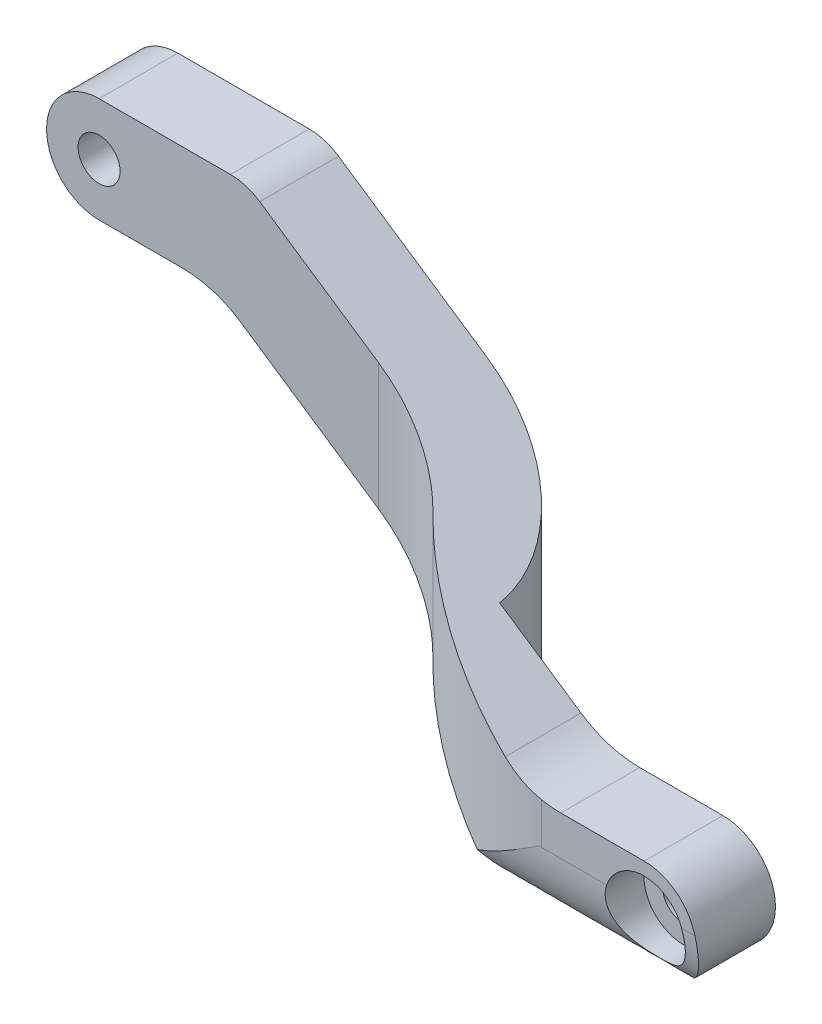
ISO-10303-21;
HEADER;
FILE_DESCRIPTION(('STEP AP214'),'2;1');
FILE_NAME('part.step','',(''),(''),'','','');
FILE_SCHEMA(('AUTOMOTIVE_DESIGN { 1 0 10303 214 1 1 1 1 }'));
ENDSEC;
DATA;
#1=APPLICATION_CONTEXT('core data for automotive mechanical design processes');
#2=APPLICATION_PROTOCOL_DEFINITION('international standard','automotive_design',2000,#1);
#3=PRODUCT_CONTEXT('',#1,'mechanical');
#4=PRODUCT('Part','Part','',(#3));
#5=PRODUCT_RELATED_PRODUCT_CATEGORY('part','',(#4));
#6=PRODUCT_DEFINITION_FORMATION('','',#4);
#7=PRODUCT_DEFINITION_CONTEXT('part definition',#1,'design');
#8=PRODUCT_DEFINITION('design','',#6,#7);
#9=PRODUCT_DEFINITION_SHAPE('','',#8);
#10=(LENGTH_UNIT() NAMED_UNIT(*) SI_UNIT(.MILLI.,.METRE.));
#11=(NAMED_UNIT(*) PLANE_ANGLE_UNIT() SI_UNIT($,.RADIAN.));
#12=(NAMED_UNIT(*) SI_UNIT($,.STERADIAN.) SOLID_ANGLE_UNIT());
#13=UNCERTAINTY_MEASURE_WITH_UNIT(LENGTH_MEASURE(1.E-05),#10,'distance_accuracy_value','');
#14=(GEOMETRIC_REPRESENTATION_CONTEXT(3) GLOBAL_UNCERTAINTY_ASSIGNED_CONTEXT((#13)) GLOBAL_UNIT_ASSIGNED_CONTEXT((#10,
#11,#12)) REPRESENTATION_CONTEXT('',''));
#15=CARTESIAN_POINT('',(0.,0.,0.));
#16=DIRECTION('',(0.,0.,1.));
#17=DIRECTION('',(1.,0.,0.));
#18=AXIS2_PLACEMENT_3D('',#15,#16,#17);
#19=CARTESIAN_POINT('',(0.,-5.5,-4.5));
#20=DIRECTION('',(0.,0.,1.));
#21=DIRECTION('',(1.,0.,0.));
#22=AXIS2_PLACEMENT_3D('',#19,#20,#21);
#23=CYLINDRICAL_SURFACE('',#22,0.799999999999998);
#24=CARTESIAN_POINT('',(0.,-5.5,0.));
#25=DIRECTION('',(0.,0.,1.));
#26=DIRECTION('',(1.,0.,0.));
#27=AXIS2_PLACEMENT_3D('',#24,#25,#26);
#28=CIRCLE('',#27,0.799999999999998);
#29=CARTESIAN_POINT('',(0.799999999999998,-5.5,0.));
#30=VERTEX_POINT('',#29);
#31=EDGE_CURVE('E339',#30,#30,#28,.F.);
#32=ORIENTED_EDGE('',*,*,#31,.T.);
#33=EDGE_LOOP('',(#32));
#34=FACE_BOUND('',#33,.T.);
#35=CARTESIAN_POINT('',(0.,-5.5,1.5));
#36=DIRECTION('',(0.,0.,1.));
#37=DIRECTION('',(1.,0.,0.));
#38=AXIS2_PLACEMENT_3D('',#35,#36,#37);
#39=CIRCLE('',#38,0.799999999999998);
#40=CARTESIAN_POINT('',(0.799999999999998,-5.5,1.5));
#41=VERTEX_POINT('',#40);
#42=EDGE_CURVE('E39',#41,#41,#39,.F.);
#43=ORIENTED_EDGE('',*,*,#42,.F.);
#44=EDGE_LOOP('',(#43));
#45=FACE_BOUND('',#44,.T.);
#46=ADVANCED_FACE('F35',(#34,#45),#23,.F.);
#47=CARTESIAN_POINT('',(0.,-5.5,-4.5));
#48=DIRECTION('',(0.,0.,1.));
#49=DIRECTION('',(1.,0.,0.));
#50=AXIS2_PLACEMENT_3D('',#47,#48,#49);
#51=CYLINDRICAL_SURFACE('',#50,2.);
#52=DIRECTION('',(0.,0.,1.));
#53=VECTOR('',#52,1.);
#54=CARTESIAN_POINT('',(1.9364916731037,-5.,-4.5));
#55=LINE('',#54,#53);
#56=CARTESIAN_POINT('',(1.9364916731037,-5.,3.));
#57=VERTEX_POINT('',#56);
#58=CARTESIAN_POINT('',(1.9364916731037,-5.,2.99949844879359));
#59=VERTEX_POINT('',#58);
#60=EDGE_CURVE('E192',#57,#59,#55,.F.);
#61=ORIENTED_EDGE('',*,*,#60,.T.);
#62=CARTESIAN_POINT('',(1.9364916731037,-5.,2.99949844879359));
#63=CARTESIAN_POINT('',(1.94951068928083,-5.05039154014287,2.99874192304591));
#64=CARTESIAN_POINT('',(1.96054437039431,-5.10128152286284,2.99709892287551));
#65=CARTESIAN_POINT('',(1.97860634253694,-5.2036705201631,2.99197444255661));
#66=CARTESIAN_POINT('',(1.98563504624341,-5.25516947143619,2.98849315189884));
#67=CARTESIAN_POINT('',(1.99564042689507,-5.35824853738819,2.97963936267847));
#68=CARTESIAN_POINT('',(1.99862886372892,-5.40982797712096,2.97427241035933));
#69=CARTESIAN_POINT('',(2.00062303694968,-5.5128141869781,2.96162666635356));
#70=CARTESIAN_POINT('',(1.99962884769324,-5.56422096030825,2.95434791036316));
#71=CARTESIAN_POINT('',(1.99075294064837,-5.71763991938488,2.92963291122908));
#72=CARTESIAN_POINT('',(1.97698454913218,-5.81892166138555,2.90931196557867));
#73=CARTESIAN_POINT('',(1.93479805650347,-6.01651647074127,2.86136881880131));
#74=CARTESIAN_POINT('',(1.90637570864741,-6.11282808883946,2.83374450227534));
#75=CARTESIAN_POINT('',(1.8355138915785,-6.30077333512743,2.77105908847287));
#76=CARTESIAN_POINT('',(1.79271965389449,-6.39221279331376,2.73581875345518));
#77=CARTESIAN_POINT('',(1.6953017912771,-6.56577250029739,2.65931334566206));
#78=CARTESIAN_POINT('',(1.64067306333566,-6.64788870557421,2.6180456764212));
#79=CARTESIAN_POINT('',(1.51530913887125,-6.80972820646089,2.52586257005735));
#80=CARTESIAN_POINT('',(1.44348295682705,-6.88828600345515,2.47438865721268));
#81=CARTESIAN_POINT('',(1.29038534629013,-7.03163935781744,2.36659003392525));
#82=CARTESIAN_POINT('',(1.20910904750735,-7.09642776980896,2.31026282615526));
#83=CARTESIAN_POINT('',(1.02780440266656,-7.21965649527167,2.18597436494093));
#84=CARTESIAN_POINT('',(0.926731786790055,-7.27601601908801,2.11747567985419));
#85=CARTESIAN_POINT('',(0.718210156132909,-7.3701005494721,1.97717287104123));
#86=CARTESIAN_POINT('',(0.610752507630267,-7.4077996505596,1.9053643025747));
#87=CARTESIAN_POINT('',(0.420477451135562,-7.4570943115328,1.7786943241674));
#88=CARTESIAN_POINT('',(0.33844819723138,-7.47291356483976,1.72423553473926));
#89=CARTESIAN_POINT('',(0.173414611958348,-7.49420081213022,1.61481835940262));
#90=CARTESIAN_POINT('',(0.0904110631343508,-7.49967660856283,1.55986038152196));
#91=CARTESIAN_POINT('',(0.00497181418730571,-7.49999537011195,1.503291791691));
#92=CARTESIAN_POINT('',(0.00248587686778617,-7.50000000504475,1.50164587586829));
#93=CARTESIAN_POINT('',(0.,-7.5,1.5));
#94=B_SPLINE_CURVE_WITH_KNOTS('',3,(#62,#63,#64,#65,#66,#67,#68,#69,#70,#71,#72,#73,#74,#75,#76,
#77,#78,#79,#80,#81,#82,#83,#84,#85,#86,#87,#88,#89,#90,#91,#92,#93),.UNSPECIFIED.,.F.,.F.,(4,2,
2,2,2,2,2,2,2,2,2,2,2,2,2,4),(0.,0.156105486751539,0.312194885310391,0.467828973699098,
0.62346015637291,0.934510835851001,1.24565170909995,1.56511929672409,1.88472491328798,
2.23803389094328,2.59152576671572,2.99337391979603,3.39577838799437,3.69446021963918,
3.99291665450242,4.00186093722053),.UNSPECIFIED.);
#95=CARTESIAN_POINT('',(0.,-7.5,1.5));
#96=VERTEX_POINT('',#95);
#97=EDGE_CURVE('E302',#59,#96,#94,.T.);
#98=ORIENTED_EDGE('',*,*,#97,.T.);
#99=DIRECTION('',(0.,0.,1.));
#100=VECTOR('',#99,1.);
#101=CARTESIAN_POINT('',(0.,-7.5,-4.5));
#102=LINE('',#101,#100);
#103=CARTESIAN_POINT('',(0.,-7.5,0.));
#104=VERTEX_POINT('',#103);
#105=EDGE_CURVE('E382',#104,#96,#102,.T.);
#106=ORIENTED_EDGE('',*,*,#105,.F.);
#107=CARTESIAN_POINT('',(0.,-5.5,0.));
#108=DIRECTION('',(0.,0.,1.));
#109=DIRECTION('',(1.,0.,0.));
#110=AXIS2_PLACEMENT_3D('',#107,#108,#109);
#111=CIRCLE('',#110,2.);
#112=CARTESIAN_POINT('',(0.,-3.5,0.));
#113=VERTEX_POINT('',#112);
#114=EDGE_CURVE('E337',#113,#104,#111,.F.);
#115=ORIENTED_EDGE('',*,*,#114,.F.);
#116=DIRECTION('',(0.,0.,1.));
#117=VECTOR('',#116,1.);
#118=CARTESIAN_POINT('',(0.,-3.5,-4.5));
#119=LINE('',#118,#117);
#120=CARTESIAN_POINT('',(0.,-3.5,3.));
#121=VERTEX_POINT('',#120);
#122=EDGE_CURVE('E379',#113,#121,#119,.T.);
#123=ORIENTED_EDGE('',*,*,#122,.T.);
#124=CARTESIAN_POINT('',(0.,-5.5,3.));
#125=DIRECTION('',(0.,0.,1.));
#126=DIRECTION('',(1.,0.,0.));
#127=AXIS2_PLACEMENT_3D('',#124,#125,#126);
#128=CIRCLE('',#127,2.);
#129=EDGE_CURVE('E346',#57,#121,#128,.T.);
#130=ORIENTED_EDGE('',*,*,#129,.F.);
#131=EDGE_LOOP('',(#61,#98,#106,#115,#123,#130));
#132=FACE_BOUND('',#131,.T.);
#133=ADVANCED_FACE('F265',(#132),#51,.T.);
#134=CARTESIAN_POINT('',(-5.,-5.5,-4.5));
#135=DIRECTION('',(0.,0.,1.));
#136=DIRECTION('',(1.,0.,0.));
#137=AXIS2_PLACEMENT_3D('',#134,#135,#136);
#138=CYLINDRICAL_SURFACE('',#137,1.99999999999982);
#139=DIRECTION('',(0.,0.,1.));
#140=VECTOR('',#139,1.);
#141=CARTESIAN_POINT('',(-4.99999999999998,-7.49999999999982,-4.5));
#142=LINE('',#141,#140);
#143=CARTESIAN_POINT('',(-5.,-7.5,0.));
#144=VERTEX_POINT('',#143);
#145=CARTESIAN_POINT('',(-5.,-7.5,1.5));
#146=VERTEX_POINT('',#145);
#147=EDGE_CURVE('E384',#144,#146,#142,.T.);
#148=ORIENTED_EDGE('',*,*,#147,.T.);
#149=CARTESIAN_POINT('',(-6.11665663799226,-7.15924017334053,2.24688622939302));
#150=CARTESIAN_POINT('',(-6.01098533267029,-7.23032185093742,2.17450878875579));
#151=CARTESIAN_POINT('',(-5.90009045905091,-7.29033595560832,2.09945104947399));
#152=CARTESIAN_POINT('',(-5.6632372431095,-7.39152289630056,1.94033230386574));
#153=CARTESIAN_POINT('',(-5.53676764732191,-7.43109579273655,1.85600814910061));
#154=CARTESIAN_POINT('',(-5.27602322715624,-7.48545682702567,1.68275865143513));
#155=CARTESIAN_POINT('',(-5.14162828978862,-7.49948529927838,1.59377087890907));
#156=CARTESIAN_POINT('',(-5.00497178236216,-7.49999537440278,1.50329177040488));
#157=CARTESIAN_POINT('',(-5.0024858451283,-7.50000000927803,1.50164585462645));
#158=CARTESIAN_POINT('',(-5.,-7.49999999999991,1.5));
#159=B_SPLINE_CURVE_WITH_KNOTS('',3,(#149,#150,#151,#152,#153,#154,#155,#156,#157,#158),
.UNSPECIFIED.,.F.,.F.,(4,2,2,2,4),(0.,0.438505616577245,0.907496862960491,1.39022088766092,
1.39916517037903),.UNSPECIFIED.);
#160=CARTESIAN_POINT('',(-6.11665663799226,-7.15924017334053,2.24688622939302));
#161=VERTEX_POINT('',#160);
#162=EDGE_CURVE('E210',#146,#161,#159,.F.);
#163=ORIENTED_EDGE('',*,*,#162,.T.);
#164=DIRECTION('',(0.,0.,1.));
#165=VECTOR('',#164,1.);
#166=CARTESIAN_POINT('',(-6.11665663799226,-7.15924017334053,-4.5));
#167=LINE('',#166,#165);
#168=CARTESIAN_POINT('',(-6.11665663799226,-7.15924017334053,0.));
#169=VERTEX_POINT('',#168);
#170=EDGE_CURVE('E387',#169,#161,#167,.T.);
#171=ORIENTED_EDGE('',*,*,#170,.F.);
#172=CARTESIAN_POINT('',(-5.,-5.5,0.));
#173=DIRECTION('',(0.,0.,1.));
#174=DIRECTION('',(1.,0.,0.));
#175=AXIS2_PLACEMENT_3D('',#172,#173,#174);
#176=CIRCLE('',#175,1.99999999999982);
#177=EDGE_CURVE('E344',#144,#169,#176,.F.);
#178=ORIENTED_EDGE('',*,*,#177,.F.);
#179=EDGE_LOOP('',(#148,#163,#171,#178));
#180=FACE_BOUND('',#179,.T.);
#181=ADVANCED_FACE('F272',(#180),#138,.T.);
#182=CARTESIAN_POINT('',(-5.22291133313636,-7.76072430045907,-4.5));
#183=DIRECTION('',(-0.558328318996176,-0.829620086670341,0.));
#184=DIRECTION('',(0.829620086670341,-0.558328318996176,0.));
#185=AXIS2_PLACEMENT_3D('',#182,#183,#184);
#186=PLANE('',#185);
#187=ORIENTED_EDGE('',*,*,#170,.T.);
#188=CARTESIAN_POINT('',(-6.11665663799226,-7.15924017334053,2.24688622939302));
#189=CARTESIAN_POINT('',(-6.1578710695168,-7.13150315896346,2.27507982111223));
#190=CARTESIAN_POINT('',(-6.19978812795227,-7.10329328175633,2.30171479782673));
#191=CARTESIAN_POINT('',(-6.28469343313913,-7.04615262535167,2.35227245099428));
#192=CARTESIAN_POINT('',(-6.32768074152116,-7.01722247766993,2.37619740799531));
#193=CARTESIAN_POINT('',(-6.41425214045248,-6.95896055222347,2.42167534398547));
#194=CARTESIAN_POINT('',(-6.45783230689211,-6.92963141535618,2.44323930340539));
#195=CARTESIAN_POINT('',(-6.54563078444566,-6.87054367487048,2.48442424275833));
#196=CARTESIAN_POINT('',(-6.5898492584233,-6.84078496164597,2.50404471640147));
#197=CARTESIAN_POINT('',(-6.680901805764,-6.77950725572508,2.54246543332115));
#198=CARTESIAN_POINT('',(-6.72776007531519,-6.74797197916905,2.56118197983403));
#199=CARTESIAN_POINT('',(-6.82191388571418,-6.68460714563647,2.59694330554592));
#200=CARTESIAN_POINT('',(-6.86920944408582,-6.65277757686649,2.61398801742756));
#201=CARTESIAN_POINT('',(-6.96416256786849,-6.58887481120687,2.64657492588808));
#202=CARTESIAN_POINT('',(-7.01182019107755,-6.55680157541956,2.66211687689748));
#203=CARTESIAN_POINT('',(-7.107811520763,-6.49220010469506,2.69194924235491));
#204=CARTESIAN_POINT('',(-7.15614758347647,-6.45967028402737,2.70622860977102));
#205=CARTESIAN_POINT('',(-7.25305641386025,-6.39445134196773,2.73350554235381));
#206=CARTESIAN_POINT('',(-7.30162912980468,-6.36176225538694,2.74650337550438));
#207=CARTESIAN_POINT('',(-7.39895220796609,-6.29626452756856,2.77130252360343));
#208=CARTESIAN_POINT('',(-7.44770243692221,-6.26345597601457,2.7831045973848));
#209=CARTESIAN_POINT('',(-7.4965379237317,-6.2305900465418,2.79435795107543));
#210=B_SPLINE_CURVE_WITH_KNOTS('',3,(#188,#189,#190,#191,#192,#193,#194,#195,#196,#197,#198,
#199,#200,#201,#202,#203,#204,#205,#206,#207,#208,#209),.UNSPECIFIED.,.F.,.F.,(4,2,2,2,2,2,2,2,
2,2,4),(0.,0.171289289833127,0.342433347499053,0.512744227752164,0.683099358984821,
0.8615759682724,1.04005976107616,1.21857267119459,1.39851844945472,1.57842651877418,
1.75821969315737),.UNSPECIFIED.);
#211=CARTESIAN_POINT('',(-6.77233581869634,-6.71797282621955,2.57811178560274));
#212=VERTEX_POINT('',#211);
#213=EDGE_CURVE('E195',#161,#212,#210,.T.);
#214=ORIENTED_EDGE('',*,*,#213,.T.);
#215=CARTESIAN_POINT('',(-3.89835345575501,-8.65214217349972,-7.));
#216=DIRECTION('',(-0.558328318996176,-0.829620086670341,0.));
#217=DIRECTION('',(-0.829620086670341,0.558328318996176,0.));
#218=AXIS2_PLACEMENT_3D('',#215,#216,#217);
#219=ELLIPSE('',#218,12.0537100784707,10.);
#220=CARTESIAN_POINT('',(-11.0397818842979,-3.84601248377317,0.));
#221=VERTEX_POINT('',#220);
#222=EDGE_CURVE('E463',#212,#221,#219,.T.);
#223=ORIENTED_EDGE('',*,*,#222,.T.);
#224=CARTESIAN_POINT('',(-14.6104960985693,-1.4429476389099,3.5));
#225=DIRECTION('',(-0.558328318996176,-0.829620086670341,0.));
#226=DIRECTION('',(-0.829620086670341,0.558328318996176,0.));
#227=AXIS2_PLACEMENT_3D('',#224,#225,#226);
#228=ELLIPSE('',#227,6.02685503923534,5.);
#229=CARTESIAN_POINT('',(-14.6104960985693,-1.4429476389099,-1.5));
#230=VERTEX_POINT('',#229);
#231=EDGE_CURVE('E473',#221,#230,#228,.F.);
#232=ORIENTED_EDGE('',*,*,#231,.T.);
#233=DIRECTION('',(0.829620086670341,-0.558328318996176,0.));
#234=VECTOR('',#233,1.);
#235=CARTESIAN_POINT('',(-5.22291133313636,-7.76072430045907,-1.5));
#236=LINE('',#235,#234);
#237=CARTESIAN_POINT('',(-19.8476514900797,2.08162006749579,-1.5));
#238=VERTEX_POINT('',#237);
#239=EDGE_CURVE('E312',#238,#230,#236,.T.);
#240=ORIENTED_EDGE('',*,*,#239,.F.);
#241=DIRECTION('',(0.,0.,1.));
#242=VECTOR('',#241,1.);
#243=CARTESIAN_POINT('',(-19.8476514900797,2.08162006749579,-4.5));
#244=LINE('',#243,#242);
#245=CARTESIAN_POINT('',(-19.8476514900797,2.08162006749579,-4.5));
#246=VERTEX_POINT('',#245);
#247=EDGE_CURVE('E401',#238,#246,#244,.F.);
#248=ORIENTED_EDGE('',*,*,#247,.T.);
#249=DIRECTION('',(0.829620086670341,-0.558328318996176,0.));
#250=VECTOR('',#249,1.);
#251=CARTESIAN_POINT('',(-5.22291133313636,-7.76072430045907,-4.5));
#252=LINE('',#251,#250);
#253=CARTESIAN_POINT('',(-13.4749371855331,-2.20717057567752,-4.5));
#254=VERTEX_POINT('',#253);
#255=EDGE_CURVE('E359',#246,#254,#252,.T.);
#256=ORIENTED_EDGE('',*,*,#255,.T.);
#257=CARTESIAN_POINT('',(-13.4749371855331,-2.20717057567752,0.5));
#258=DIRECTION('',(-0.558328318996176,-0.829620086670341,0.));
#259=DIRECTION('',(-0.829620086670341,0.558328318996176,0.));
#260=AXIS2_PLACEMENT_3D('',#257,#258,#259);
#261=ELLIPSE('',#260,6.02685503923534,5.);
#262=CARTESIAN_POINT('',(-8.5,-5.55526732567099,0.));
#263=VERTEX_POINT('',#262);
#264=EDGE_CURVE('E458',#254,#263,#261,.T.);
#265=ORIENTED_EDGE('',*,*,#264,.T.);
#266=DIRECTION('',(-0.829620086670341,0.558328318996176,0.));
#267=VECTOR('',#266,1.);
#268=CARTESIAN_POINT('',(-5.22291133313636,-7.76072430045907,0.));
#269=LINE('',#268,#267);
#270=EDGE_CURVE('E341',#169,#263,#269,.T.);
#271=ORIENTED_EDGE('',*,*,#270,.F.);
#272=EDGE_LOOP('',(#187,#214,#223,#232,#240,#248,#256,#265,#271));
#273=FACE_BOUND('',#272,.T.);
#274=ADVANCED_FACE('F217',(#273),#186,.T.);
#275=CARTESIAN_POINT('',(0.,0.,3.));
#276=DIRECTION('',(0.,0.,1.));
#277=DIRECTION('',(1.,0.,0.));
#278=AXIS2_PLACEMENT_3D('',#275,#276,#277);
#279=PLANE('',#278);
#280=CARTESIAN_POINT('',(0.,-5.5,3.));
#281=DIRECTION('',(0.,0.,1.));
#282=DIRECTION('',(1.,0.,0.));
#283=AXIS2_PLACEMENT_3D('',#280,#281,#282);
#284=CIRCLE('',#283,1.51);
#285=CARTESIAN_POINT('',(1.42481577756565,-5.,3.));
#286=VERTEX_POINT('',#285);
#287=CARTESIAN_POINT('',(-1.42481577756565,-5.,3.));
#288=VERTEX_POINT('',#287);
#289=EDGE_CURVE('E179',#286,#288,#284,.T.);
#290=ORIENTED_EDGE('',*,*,#289,.F.);
#291=DIRECTION('',(1.,0.,0.));
#292=VECTOR('',#291,1.);
#293=CARTESIAN_POINT('',(0.,-5.,3.));
#294=LINE('',#293,#292);
#295=EDGE_CURVE('E185',#286,#57,#294,.T.);
#296=ORIENTED_EDGE('',*,*,#295,.T.);
#297=ORIENTED_EDGE('',*,*,#129,.T.);
#298=DIRECTION('',(-1.,0.,0.));
#299=VECTOR('',#298,1.);
#300=CARTESIAN_POINT('',(0.,-3.5,3.));
#301=LINE('',#300,#299);
#302=CARTESIAN_POINT('',(-3.16903523393557,-3.50000000000001,3.));
#303=VERTEX_POINT('',#302);
#304=EDGE_CURVE('E348',#121,#303,#301,.T.);
#305=ORIENTED_EDGE('',*,*,#304,.T.);
#306=CARTESIAN_POINT('',(-3.16903523393558,0.499999999999995,3.));
#307=DIRECTION('',(0.,0.,1.));
#308=DIRECTION('',(1.,0.,0.));
#309=AXIS2_PLACEMENT_3D('',#306,#307,#308);
#310=CIRCLE('',#309,4.);
#311=CARTESIAN_POINT('',(-3.89835345575501,-3.43294990195937,3.));
#312=VERTEX_POINT('',#311);
#313=EDGE_CURVE('E403',#303,#312,#310,.F.);
#314=ORIENTED_EDGE('',*,*,#313,.T.);
#315=DIRECTION('',(0.,-1.,0.));
#316=VECTOR('',#315,1.);
#317=CARTESIAN_POINT('',(-3.89835345575501,-3.03154444350354,3.));
#318=LINE('',#317,#316);
#319=CARTESIAN_POINT('',(-3.89835345575501,-5.,3.));
#320=VERTEX_POINT('',#319);
#321=EDGE_CURVE('E424',#312,#320,#318,.T.);
#322=ORIENTED_EDGE('',*,*,#321,.T.);
#323=EDGE_CURVE('E58',#320,#288,#294,.T.);
#324=ORIENTED_EDGE('',*,*,#323,.T.);
#325=EDGE_LOOP('',(#290,#296,#297,#305,#314,#322,#324));
#326=FACE_BOUND('',#325,.T.);
#327=ADVANCED_FACE('F184',(#326),#279,.T.);
#328=CARTESIAN_POINT('',(-3.89835345575501,-7.5,-7.));
#329=DIRECTION('',(0.,1.,0.));
#330=DIRECTION('',(0.,0.,1.));
#331=AXIS2_PLACEMENT_3D('',#328,#329,#330);
#332=CYLINDRICAL_SURFACE('',#331,10.);
#333=ORIENTED_EDGE('',*,*,#222,.F.);
#334=CARTESIAN_POINT('',(-9.16618033218138,-7.5,1.5));
#335=CARTESIAN_POINT('',(-9.0783770752633,-7.49997534086262,1.5544298836014));
#336=CARTESIAN_POINT('',(-8.9898293122405,-7.49493500026954,1.60740999048573));
#337=CARTESIAN_POINT('',(-8.81199132605971,-7.4762290743827,1.71014467578788));
#338=CARTESIAN_POINT('',(-8.72270290774386,-7.46258048889979,1.75990539887934));
#339=CARTESIAN_POINT('',(-8.5444165622347,-7.4281759974275,1.85574917663667));
#340=CARTESIAN_POINT('',(-8.45542108923238,-7.40747135816712,1.90185588179667));
#341=CARTESIAN_POINT('',(-8.2773638030116,-7.36005457224481,1.99078255753107));
#342=CARTESIAN_POINT('',(-8.18830197743016,-7.33334018351012,2.03360129343678));
#343=CARTESIAN_POINT('',(-8.00508896483491,-7.27313986164803,2.1184159832254));
#344=CARTESIAN_POINT('',(-7.91094789657471,-7.23934715560389,2.16021394350262));
#345=CARTESIAN_POINT('',(-7.72293326724148,-7.16702231851159,2.24029419468675));
#346=CARTESIAN_POINT('',(-7.62905990109978,-7.12848734935375,2.27857435612089));
#347=CARTESIAN_POINT('',(-7.44179321906792,-7.04750439411017,2.35169126042084));
#348=CARTESIAN_POINT('',(-7.34839952463928,-7.00506025619496,2.38653132114371));
#349=CARTESIAN_POINT('',(-7.16204679584242,-6.9168673515824,2.45294062340633));
#350=CARTESIAN_POINT('',(-7.0690876821787,-6.87111921497572,2.48451048581003));
#351=CARTESIAN_POINT('',(-6.79089341118731,-6.72974385374828,2.57450874519508));
#352=CARTESIAN_POINT('',(-6.60625239694915,-6.62994616014004,2.62826027264948));
#353=CARTESIAN_POINT('',(-6.21963242694717,-6.41191709249063,2.72910910967403));
#354=CARTESIAN_POINT('',(-6.01781110465762,-6.29284426619907,2.77496404586718));
#355=CARTESIAN_POINT('',(-5.71615795223554,-6.10945055908654,2.83392422745021));
#356=CARTESIAN_POINT('',(-5.61579037276104,-6.04752427416977,2.85194010289817));
#357=CARTESIAN_POINT('',(-5.41533834467033,-5.92236728763325,2.88479001081547));
#358=CARTESIAN_POINT('',(-5.31525391728634,-5.85913649099574,2.89962381060612));
#359=CARTESIAN_POINT('',(-5.01182429336506,-5.66567467376685,2.93993628666814));
#360=CARTESIAN_POINT('',(-4.80882949227546,-5.53384042494789,2.96053968859981));
#361=CARTESIAN_POINT('',(-4.50475165717412,-5.33450601907926,2.98211394085308));
#362=CARTESIAN_POINT('',(-4.40345111457194,-5.2677904833755,2.98775031547149));
#363=CARTESIAN_POINT('',(-4.20093535127152,-5.13406362067646,2.99593437328131));
#364=CARTESIAN_POINT('',(-4.0997201228302,-5.06705232499783,2.99848237596795));
#365=CARTESIAN_POINT('',(-3.99850720040195,-5.00000000006024,2.99949844879139));
#366=B_SPLINE_CURVE_WITH_KNOTS('',3,(#334,#335,#336,#337,#338,#339,#340,#341,#342,#343,#344,
#345,#346,#347,#348,#349,#350,#351,#352,#353,#354,#355,#356,#357,#358,#359,#360,#361,#362,#363,
#364,#365),.UNSPECIFIED.,.F.,.F.,(4,2,2,2,2,2,2,2,2,2,2,2,2,2,2,4),(0.,0.3095951052134,
0.618580719268322,0.925367595644661,1.23226911616131,1.55729857681577,1.88252351307185,
2.2074316529334,2.53227799381765,3.18166189524148,3.89744544849593,4.25531094106918,
4.61320259245163,5.34155463569978,5.70580507153351,6.07001782206985),.UNSPECIFIED.);
#367=CARTESIAN_POINT('',(-3.99850720044046,-5.,2.99949844879359));
#368=VERTEX_POINT('',#367);
#369=EDGE_CURVE('E44',#212,#368,#366,.T.);
#370=ORIENTED_EDGE('',*,*,#369,.T.);
#371=CARTESIAN_POINT('',(-3.89835345575501,-5.,-7.));
#372=DIRECTION('',(0.,-1.,0.));
#373=DIRECTION('',(0.,0.,-1.));
#374=AXIS2_PLACEMENT_3D('',#371,#372,#373);
#375=CIRCLE('',#374,10.);
#376=EDGE_CURVE('E475',#368,#320,#375,.F.);
#377=ORIENTED_EDGE('',*,*,#376,.T.);
#378=ORIENTED_EDGE('',*,*,#321,.F.);
#379=CARTESIAN_POINT('',(-5.40234850992031,-2.81848034668135,2.8862530251378));
#380=CARTESIAN_POINT('',(-5.3126478498518,-2.87886191439437,2.8999088807479));
#381=CARTESIAN_POINT('',(-5.2203833763557,-2.93565707909186,2.91268681153101));
#382=CARTESIAN_POINT('',(-5.03126556620226,-3.04172806795074,2.9360728362386));
#383=CARTESIAN_POINT('',(-4.93440846008353,-3.09099757027577,2.94667910840767));
#384=CARTESIAN_POINT('',(-4.73856761611249,-3.18075655928937,2.96511680979207));
#385=CARTESIAN_POINT('',(-4.63965314265386,-3.22138762698421,2.97299458038485));
#386=CARTESIAN_POINT('',(-4.43878217198691,-3.29462198732626,2.9858924707941));
#387=CARTESIAN_POINT('',(-4.33682802045417,-3.32723129921923,2.99091473701511));
#388=CARTESIAN_POINT('',(-4.17855015271291,-3.37093745255753,2.99622629620727));
#389=CARTESIAN_POINT('',(-4.12306116502327,-3.38498523820993,2.99763049202541));
#390=CARTESIAN_POINT('',(-4.01124575497914,-3.41075300040046,2.99951996326423));
#391=CARTESIAN_POINT('',(-3.95491657328685,-3.42246133171011,3.00000073946189));
#392=CARTESIAN_POINT('',(-3.89835345575501,-3.43294990195937,3.));
#393=B_SPLINE_CURVE_WITH_KNOTS('',3,(#379,#380,#381,#382,#383,#384,#385,#386,#387,#388,#389,
#390,#391,#392),.UNSPECIFIED.,.F.,.F.,(4,2,2,2,2,2,4),(0.,0.326897006936239,0.65406712691467,
0.975371332632097,1.29643370238128,1.46815088278995,1.64070262772593),.UNSPECIFIED.);
#394=CARTESIAN_POINT('',(-5.40234850992031,-2.81848034668135,2.8862530251378));
#395=VERTEX_POINT('',#394);
#396=EDGE_CURVE('E416',#395,#312,#393,.T.);
#397=ORIENTED_EDGE('',*,*,#396,.F.);
#398=CARTESIAN_POINT('',(-3.89835345575501,-3.83065814211167,-7.));
#399=DIRECTION('',(-0.558328318996184,-0.829620086670335,0.));
#400=DIRECTION('',(-0.829620086670336,0.558328318996185,0.));
#401=AXIS2_PLACEMENT_3D('',#398,#399,#400);
#402=ELLIPSE('',#401,12.0537100784708,10.);
#403=CARTESIAN_POINT('',(-11.0397818842979,0.975471547614981,0.));
#404=VERTEX_POINT('',#403);
#405=EDGE_CURVE('E414',#404,#395,#402,.F.);
#406=ORIENTED_EDGE('',*,*,#405,.F.);
#407=DIRECTION('',(0.,1.,0.));
#408=VECTOR('',#407,1.);
#409=CARTESIAN_POINT('',(-11.0397818842979,-7.5,0.));
#410=LINE('',#409,#408);
#411=EDGE_CURVE('E468',#404,#221,#410,.F.);
#412=ORIENTED_EDGE('',*,*,#411,.T.);
#413=EDGE_LOOP('',(#333,#370,#377,#378,#397,#406,#412));
#414=FACE_BOUND('',#413,.T.);
#415=ADVANCED_FACE('F426',(#414),#332,.T.);
#416=CARTESIAN_POINT('',(0.,6.76313972081444,-4.5));
#417=DIRECTION('',(0.,-1.,0.));
#418=DIRECTION('',(0.,0.,-1.));
#419=AXIS2_PLACEMENT_3D('',#416,#417,#418);
#420=PLANE('',#419);
#421=DIRECTION('',(0.,0.,1.));
#422=VECTOR('',#421,1.);
#423=CARTESIAN_POINT('',(-25.25,6.76313972081444,-4.5));
#424=LINE('',#423,#422);
#425=CARTESIAN_POINT('',(-25.25,6.76313972081444,-4.5));
#426=VERTEX_POINT('',#425);
#427=CARTESIAN_POINT('',(-25.25,6.76313972081444,-1.5));
#428=VERTEX_POINT('',#427);
#429=EDGE_CURVE('E371',#426,#428,#424,.T.);
#430=ORIENTED_EDGE('',*,*,#429,.T.);
#431=DIRECTION('',(-1.,0.,0.));
#432=VECTOR('',#431,1.);
#433=CARTESIAN_POINT('',(-27.25,6.76313972081444,-1.5));
#434=LINE('',#433,#432);
#435=CARTESIAN_POINT('',(-20.25,6.76313972081444,-1.5));
#436=VERTEX_POINT('',#435);
#437=EDGE_CURVE('E308',#436,#428,#434,.T.);
#438=ORIENTED_EDGE('',*,*,#437,.F.);
#439=DIRECTION('',(0.,0.,1.));
#440=VECTOR('',#439,1.);
#441=CARTESIAN_POINT('',(-20.25,6.76313972081444,-4.5));
#442=LINE('',#441,#440);
#443=CARTESIAN_POINT('',(-20.25,6.76313972081444,-4.5));
#444=VERTEX_POINT('',#443);
#445=EDGE_CURVE('E372',#444,#436,#442,.T.);
#446=ORIENTED_EDGE('',*,*,#445,.F.);
#447=DIRECTION('',(1.,0.,0.));
#448=VECTOR('',#447,1.);
#449=CARTESIAN_POINT('',(0.,6.76313972081444,-4.5));
#450=LINE('',#449,#448);
#451=EDGE_CURVE('E351',#426,#444,#450,.T.);
#452=ORIENTED_EDGE('',*,*,#451,.F.);
#453=EDGE_LOOP('',(#430,#438,#446,#452));
#454=FACE_BOUND('',#453,.T.);
#455=ADVANCED_FACE('F291',(#454),#420,.F.);
#456=CARTESIAN_POINT('',(-20.25,4.76313972081444,-4.5));
#457=DIRECTION('',(0.,0.,1.));
#458=DIRECTION('',(1.,0.,0.));
#459=AXIS2_PLACEMENT_3D('',#456,#457,#458);
#460=CYLINDRICAL_SURFACE('',#459,2.);
#461=CARTESIAN_POINT('',(-20.25,4.76313972081444,-1.5));
#462=DIRECTION('',(0.,0.,-1.));
#463=DIRECTION('',(-1.,0.,0.));
#464=AXIS2_PLACEMENT_3D('',#461,#462,#463);
#465=CIRCLE('',#464,2.);
#466=CARTESIAN_POINT('',(-19.1333433620078,6.4223798941552,-1.5));
#467=VERTEX_POINT('',#466);
#468=EDGE_CURVE('E323',#467,#436,#465,.F.);
#469=ORIENTED_EDGE('',*,*,#468,.F.);
#470=DIRECTION('',(0.,0.,1.));
#471=VECTOR('',#470,1.);
#472=CARTESIAN_POINT('',(-19.1333433620078,6.4223798941552,-4.5));
#473=LINE('',#472,#471);
#474=CARTESIAN_POINT('',(-19.1333433620078,6.4223798941552,-4.5));
#475=VERTEX_POINT('',#474);
#476=EDGE_CURVE('E376',#475,#467,#473,.T.);
#477=ORIENTED_EDGE('',*,*,#476,.F.);
#478=CARTESIAN_POINT('',(-20.25,4.76313972081444,-4.5));
#479=DIRECTION('',(0.,0.,1.));
#480=DIRECTION('',(1.,0.,0.));
#481=AXIS2_PLACEMENT_3D('',#478,#479,#480);
#482=CIRCLE('',#481,2.);
#483=EDGE_CURVE('E365',#475,#444,#482,.T.);
#484=ORIENTED_EDGE('',*,*,#483,.T.);
#485=ORIENTED_EDGE('',*,*,#445,.T.);
#486=EDGE_LOOP('',(#469,#477,#484,#485));
#487=FACE_BOUND('',#486,.T.);
#488=ADVANCED_FACE('F287',(#487),#460,.T.);
#489=CARTESIAN_POINT('',(-2.9895980571518,-4.44224395377784,-4.5));
#490=DIRECTION('',(-0.558328318996184,-0.829620086670335,0.));
#491=DIRECTION('',(0.829620086670336,-0.558328318996185,0.));
#492=AXIS2_PLACEMENT_3D('',#489,#490,#491);
#493=PLANE('',#492);
#494=DIRECTION('',(-0.829620086670336,0.558328318996185,0.));
#495=VECTOR('',#494,1.);
#496=CARTESIAN_POINT('',(-2.9895980571518,-4.44224395377784,0.));
#497=LINE('',#496,#495);
#498=CARTESIAN_POINT('',(-5.40234850992031,-2.81848034668135,0.));
#499=VERTEX_POINT('',#498);
#500=CARTESIAN_POINT('',(-8.5,-0.73378329428287,0.));
#501=VERTEX_POINT('',#500);
#502=EDGE_CURVE('E334',#499,#501,#497,.T.);
#503=ORIENTED_EDGE('',*,*,#502,.T.);
#504=CARTESIAN_POINT('',(-13.4749371855331,2.61431345571067,0.5));
#505=DIRECTION('',(-0.558328318996184,-0.829620086670335,0.));
#506=DIRECTION('',(-0.829620086670336,0.558328318996185,0.));
#507=AXIS2_PLACEMENT_3D('',#504,#505,#506);
#508=ELLIPSE('',#507,6.02685503923538,5.);
#509=CARTESIAN_POINT('',(-13.4749371855331,2.61431345571067,-4.5));
#510=VERTEX_POINT('',#509);
#511=EDGE_CURVE('E459',#501,#510,#508,.F.);
#512=ORIENTED_EDGE('',*,*,#511,.T.);
#513=DIRECTION('',(0.829620086670335,-0.558328318996185,0.));
#514=VECTOR('',#513,1.);
#515=CARTESIAN_POINT('',(-2.9895980571518,-4.44224395377784,-4.5));
#516=LINE('',#515,#514);
#517=EDGE_CURVE('E362',#475,#510,#516,.T.);
#518=ORIENTED_EDGE('',*,*,#517,.F.);
#519=ORIENTED_EDGE('',*,*,#476,.T.);
#520=DIRECTION('',(0.829620086670335,-0.558328318996184,0.));
#521=VECTOR('',#520,1.);
#522=CARTESIAN_POINT('',(-2.9895980571518,-4.44224395377784,-1.5));
#523=LINE('',#522,#521);
#524=CARTESIAN_POINT('',(-14.6104960985693,3.3785363924783,-1.5));
#525=VERTEX_POINT('',#524);
#526=EDGE_CURVE('E320',#467,#525,#523,.T.);
#527=ORIENTED_EDGE('',*,*,#526,.T.);
#528=CARTESIAN_POINT('',(-14.6104960985693,3.3785363924783,3.5));
#529=DIRECTION('',(-0.558328318996184,-0.829620086670335,0.));
#530=DIRECTION('',(-0.829620086670336,0.558328318996185,0.));
#531=AXIS2_PLACEMENT_3D('',#528,#529,#530);
#532=ELLIPSE('',#531,6.02685503923538,5.);
#533=EDGE_CURVE('E471',#525,#404,#532,.T.);
#534=ORIENTED_EDGE('',*,*,#533,.T.);
#535=ORIENTED_EDGE('',*,*,#405,.T.);
#536=DIRECTION('',(0.,0.,1.));
#537=VECTOR('',#536,1.);
#538=CARTESIAN_POINT('',(-5.40234850992031,-2.81848034668135,-4.5));
#539=LINE('',#538,#537);
#540=EDGE_CURVE('E396',#395,#499,#539,.F.);
#541=ORIENTED_EDGE('',*,*,#540,.T.);
#542=EDGE_LOOP('',(#503,#512,#518,#519,#527,#534,#535,#541));
#543=FACE_BOUND('',#542,.T.);
#544=ADVANCED_FACE('F290',(#543),#493,.F.);
#545=CARTESIAN_POINT('',(0.,-3.5,-4.5));
#546=DIRECTION('',(0.,1.,0.));
#547=DIRECTION('',(-1.,0.,0.));
#548=AXIS2_PLACEMENT_3D('',#545,#546,#547);
#549=PLANE('',#548);
#550=DIRECTION('',(1.,0.,0.));
#551=VECTOR('',#550,1.);
#552=CARTESIAN_POINT('',(0.,-3.5,0.));
#553=LINE('',#552,#551);
#554=CARTESIAN_POINT('',(-3.16903523393557,-3.50000000000001,0.));
#555=VERTEX_POINT('',#554);
#556=EDGE_CURVE('E331',#555,#113,#553,.T.);
#557=ORIENTED_EDGE('',*,*,#556,.F.);
#558=DIRECTION('',(0.,0.,1.));
#559=VECTOR('',#558,1.);
#560=CARTESIAN_POINT('',(-3.16903523393557,-3.50000000000001,-4.5));
#561=LINE('',#560,#559);
#562=EDGE_CURVE('E375',#555,#303,#561,.T.);
#563=ORIENTED_EDGE('',*,*,#562,.T.);
#564=ORIENTED_EDGE('',*,*,#304,.F.);
#565=ORIENTED_EDGE('',*,*,#122,.F.);
#566=EDGE_LOOP('',(#557,#563,#564,#565));
#567=FACE_BOUND('',#566,.T.);
#568=ADVANCED_FACE('F295',(#567),#549,.T.);
#569=CARTESIAN_POINT('',(-2.6411164921747E-13,-7.5,-4.5));
#570=DIRECTION('',(0.,1.,0.));
#571=DIRECTION('',(-1.,0.,0.));
#572=AXIS2_PLACEMENT_3D('',#569,#570,#571);
#573=PLANE('',#572);
#574=ORIENTED_EDGE('',*,*,#105,.T.);
#575=DIRECTION('',(1.,0.,0.));
#576=VECTOR('',#575,1.);
#577=CARTESIAN_POINT('',(-27.25,-7.5,1.5));
#578=LINE('',#577,#576);
#579=EDGE_CURVE('E197',#146,#96,#578,.T.);
#580=ORIENTED_EDGE('',*,*,#579,.F.);
#581=ORIENTED_EDGE('',*,*,#147,.F.);
#582=DIRECTION('',(1.,0.,0.));
#583=VECTOR('',#582,1.);
#584=CARTESIAN_POINT('',(-8.5,-7.5,0.));
#585=LINE('',#584,#583);
#586=EDGE_CURVE('E325',#144,#104,#585,.T.);
#587=ORIENTED_EDGE('',*,*,#586,.T.);
#588=EDGE_LOOP('',(#574,#580,#581,#587));
#589=FACE_BOUND('',#588,.T.);
#590=ADVANCED_FACE('F298',(#589),#573,.F.);
#591=CARTESIAN_POINT('',(0.,2.76313972081444,-4.5));
#592=DIRECTION('',(0.,-1.,0.));
#593=DIRECTION('',(1.,0.,0.));
#594=AXIS2_PLACEMENT_3D('',#591,#592,#593);
#595=PLANE('',#594);
#596=DIRECTION('',(1.,0.,0.));
#597=VECTOR('',#596,1.);
#598=CARTESIAN_POINT('',(0.,2.76313972081444,-1.5));
#599=LINE('',#598,#597);
#600=CARTESIAN_POINT('',(-25.25,2.76313972081442,-1.5));
#601=VERTEX_POINT('',#600);
#602=CARTESIAN_POINT('',(-22.0809647660644,2.76313972081443,-1.5));
#603=VERTEX_POINT('',#602);
#604=EDGE_CURVE('E310',#601,#603,#599,.T.);
#605=ORIENTED_EDGE('',*,*,#604,.F.);
#606=DIRECTION('',(0.,0.,1.));
#607=VECTOR('',#606,1.);
#608=CARTESIAN_POINT('',(-25.25,2.76313972081442,-4.5));
#609=LINE('',#608,#607);
#610=CARTESIAN_POINT('',(-25.25,2.76313972081442,-4.5));
#611=VERTEX_POINT('',#610);
#612=EDGE_CURVE('E390',#611,#601,#609,.T.);
#613=ORIENTED_EDGE('',*,*,#612,.F.);
#614=DIRECTION('',(1.,0.,0.));
#615=VECTOR('',#614,1.);
#616=CARTESIAN_POINT('',(0.,2.76313972081444,-4.5));
#617=LINE('',#616,#615);
#618=CARTESIAN_POINT('',(-22.0809647660644,2.76313972081443,-4.5));
#619=VERTEX_POINT('',#618);
#620=EDGE_CURVE('E356',#611,#619,#617,.T.);
#621=ORIENTED_EDGE('',*,*,#620,.T.);
#622=DIRECTION('',(0.,0.,1.));
#623=VECTOR('',#622,1.);
#624=CARTESIAN_POINT('',(-22.0809647660644,2.76313972081443,3.));
#625=LINE('',#624,#623);
#626=EDGE_CURVE('E398',#619,#603,#625,.T.);
#627=ORIENTED_EDGE('',*,*,#626,.T.);
#628=EDGE_LOOP('',(#605,#613,#621,#627));
#629=FACE_BOUND('',#628,.T.);
#630=ADVANCED_FACE('F285',(#629),#595,.T.);
#631=CARTESIAN_POINT('',(-25.25,4.76313972081443,-4.5));
#632=DIRECTION('',(0.,0.,1.));
#633=DIRECTION('',(1.,0.,0.));
#634=AXIS2_PLACEMENT_3D('',#631,#632,#633);
#635=CYLINDRICAL_SURFACE('',#634,0.800000000000007);
#636=CARTESIAN_POINT('',(-25.25,4.76313972081443,-1.5));
#637=DIRECTION('',(0.,0.,-1.));
#638=DIRECTION('',(-1.,0.,0.));
#639=AXIS2_PLACEMENT_3D('',#636,#637,#638);
#640=CIRCLE('',#639,0.800000000000007);
#641=CARTESIAN_POINT('',(-26.05,4.76313972081443,-1.5));
#642=VERTEX_POINT('',#641);
#643=EDGE_CURVE('E317',#642,#642,#640,.F.);
#644=ORIENTED_EDGE('',*,*,#643,.T.);
#645=EDGE_LOOP('',(#644));
#646=FACE_BOUND('',#645,.T.);
#647=CARTESIAN_POINT('',(-25.25,4.76313972081443,-4.5));
#648=DIRECTION('',(0.,0.,1.));
#649=DIRECTION('',(1.,0.,0.));
#650=AXIS2_PLACEMENT_3D('',#647,#648,#649);
#651=CIRCLE('',#650,0.800000000000007);
#652=CARTESIAN_POINT('',(-24.45,4.76313972081443,-4.5));
#653=VERTEX_POINT('',#652);
#654=EDGE_CURVE('E368',#653,#653,#651,.T.);
#655=ORIENTED_EDGE('',*,*,#654,.F.);
#656=EDGE_LOOP('',(#655));
#657=FACE_BOUND('',#656,.T.);
#658=ADVANCED_FACE('F281',(#646,#657),#635,.F.);
#659=CARTESIAN_POINT('',(-25.25,4.76313972081443,-4.5));
#660=DIRECTION('',(0.,0.,1.));
#661=DIRECTION('',(1.,0.,0.));
#662=AXIS2_PLACEMENT_3D('',#659,#660,#661);
#663=CYLINDRICAL_SURFACE('',#662,2.);
#664=ORIENTED_EDGE('',*,*,#612,.T.);
#665=CARTESIAN_POINT('',(-25.25,4.76313972081443,-1.5));
#666=DIRECTION('',(0.,0.,-1.));
#667=DIRECTION('',(-1.,0.,0.));
#668=AXIS2_PLACEMENT_3D('',#665,#666,#667);
#669=CIRCLE('',#668,2.);
#670=EDGE_CURVE('E315',#428,#601,#669,.F.);
#671=ORIENTED_EDGE('',*,*,#670,.F.);
#672=ORIENTED_EDGE('',*,*,#429,.F.);
#673=CARTESIAN_POINT('',(-25.25,4.76313972081443,-4.5));
#674=DIRECTION('',(0.,0.,1.));
#675=DIRECTION('',(1.,0.,0.));
#676=AXIS2_PLACEMENT_3D('',#673,#674,#675);
#677=CIRCLE('',#676,2.);
#678=EDGE_CURVE('E353',#426,#611,#677,.T.);
#679=ORIENTED_EDGE('',*,*,#678,.T.);
#680=EDGE_LOOP('',(#664,#671,#672,#679));
#681=FACE_BOUND('',#680,.T.);
#682=ADVANCED_FACE('F284',(#681),#663,.T.);
#683=CARTESIAN_POINT('',(0.,0.,-4.5));
#684=DIRECTION('',(0.,0.,1.));
#685=DIRECTION('',(1.,0.,0.));
#686=AXIS2_PLACEMENT_3D('',#683,#684,#685);
#687=PLANE('',#686);
#688=ORIENTED_EDGE('',*,*,#517,.T.);
#689=DIRECTION('',(0.,1.,0.));
#690=VECTOR('',#689,1.);
#691=CARTESIAN_POINT('',(-13.4749371855331,0.,-4.5));
#692=LINE('',#691,#690);
#693=EDGE_CURVE('E454',#510,#254,#692,.F.);
#694=ORIENTED_EDGE('',*,*,#693,.T.);
#695=ORIENTED_EDGE('',*,*,#255,.F.);
#696=CARTESIAN_POINT('',(-22.0809647660644,-1.23686027918557,-4.5));
#697=DIRECTION('',(0.,0.,1.));
#698=DIRECTION('',(1.,0.,0.));
#699=AXIS2_PLACEMENT_3D('',#696,#697,#698);
#700=CIRCLE('',#699,4.);
#701=EDGE_CURVE('E406',#246,#619,#700,.T.);
#702=ORIENTED_EDGE('',*,*,#701,.T.);
#703=ORIENTED_EDGE('',*,*,#620,.F.);
#704=ORIENTED_EDGE('',*,*,#678,.F.);
#705=ORIENTED_EDGE('',*,*,#451,.T.);
#706=ORIENTED_EDGE('',*,*,#483,.F.);
#707=EDGE_LOOP('',(#688,#694,#695,#702,#703,#704,#705,#706));
#708=FACE_BOUND('',#707,.T.);
#709=ORIENTED_EDGE('',*,*,#654,.T.);
#710=EDGE_LOOP('',(#709));
#711=FACE_BOUND('',#710,.T.);
#712=ADVANCED_FACE('F279',(#708,#711),#687,.F.);
#713=CARTESIAN_POINT('',(-3.16903523393558,0.499999999999995,-4.5));
#714=DIRECTION('',(0.,0.,1.));
#715=DIRECTION('',(1.,0.,0.));
#716=AXIS2_PLACEMENT_3D('',#713,#714,#715);
#717=CYLINDRICAL_SURFACE('',#716,4.);
#718=ORIENTED_EDGE('',*,*,#540,.F.);
#719=ORIENTED_EDGE('',*,*,#396,.T.);
#720=ORIENTED_EDGE('',*,*,#313,.F.);
#721=ORIENTED_EDGE('',*,*,#562,.F.);
#722=CARTESIAN_POINT('',(-3.16903523393558,0.499999999999995,0.));
#723=DIRECTION('',(0.,0.,1.));
#724=DIRECTION('',(1.,0.,0.));
#725=AXIS2_PLACEMENT_3D('',#722,#723,#724);
#726=CIRCLE('',#725,4.);
#727=EDGE_CURVE('E408',#555,#499,#726,.F.);
#728=ORIENTED_EDGE('',*,*,#727,.T.);
#729=EDGE_LOOP('',(#718,#719,#720,#721,#728));
#730=FACE_BOUND('',#729,.T.);
#731=ADVANCED_FACE('F429',(#730),#717,.F.);
#732=CARTESIAN_POINT('',(-22.0809647660644,-1.23686027918557,-4.5));
#733=DIRECTION('',(0.,0.,-1.));
#734=DIRECTION('',(-1.,0.,0.));
#735=AXIS2_PLACEMENT_3D('',#732,#733,#734);
#736=CYLINDRICAL_SURFACE('',#735,4.);
#737=ORIENTED_EDGE('',*,*,#247,.F.);
#738=CARTESIAN_POINT('',(-22.0809647660644,-1.23686027918557,-1.5));
#739=DIRECTION('',(0.,0.,-1.));
#740=DIRECTION('',(-1.,0.,0.));
#741=AXIS2_PLACEMENT_3D('',#738,#739,#740);
#742=CIRCLE('',#741,4.);
#743=EDGE_CURVE('E411',#238,#603,#742,.F.);
#744=ORIENTED_EDGE('',*,*,#743,.T.);
#745=ORIENTED_EDGE('',*,*,#626,.F.);
#746=ORIENTED_EDGE('',*,*,#701,.F.);
#747=EDGE_LOOP('',(#737,#744,#745,#746));
#748=FACE_BOUND('',#747,.T.);
#749=ADVANCED_FACE('F433',(#748),#736,.F.);
#750=CARTESIAN_POINT('',(-8.5,-7.5,0.));
#751=DIRECTION('',(0.,0.,1.));
#752=DIRECTION('',(1.,0.,0.));
#753=AXIS2_PLACEMENT_3D('',#750,#751,#752);
#754=PLANE('',#753);
#755=ORIENTED_EDGE('',*,*,#177,.T.);
#756=ORIENTED_EDGE('',*,*,#270,.T.);
#757=DIRECTION('',(0.,1.,0.));
#758=VECTOR('',#757,1.);
#759=CARTESIAN_POINT('',(-8.5,-7.5,0.));
#760=LINE('',#759,#758);
#761=EDGE_CURVE('E328',#263,#501,#760,.T.);
#762=ORIENTED_EDGE('',*,*,#761,.T.);
#763=ORIENTED_EDGE('',*,*,#502,.F.);
#764=ORIENTED_EDGE('',*,*,#727,.F.);
#765=ORIENTED_EDGE('',*,*,#556,.T.);
#766=ORIENTED_EDGE('',*,*,#114,.T.);
#767=ORIENTED_EDGE('',*,*,#586,.F.);
#768=EDGE_LOOP('',(#755,#756,#762,#763,#764,#765,#766,#767));
#769=FACE_BOUND('',#768,.T.);
#770=ORIENTED_EDGE('',*,*,#31,.F.);
#771=EDGE_LOOP('',(#770));
#772=FACE_BOUND('',#771,.T.);
#773=ADVANCED_FACE('F437',(#769,#772),#754,.F.);
#774=CARTESIAN_POINT('',(-27.25,-7.5,-1.5));
#775=DIRECTION('',(0.,0.,-1.));
#776=DIRECTION('',(-1.,0.,0.));
#777=AXIS2_PLACEMENT_3D('',#774,#775,#776);
#778=PLANE('',#777);
#779=ORIENTED_EDGE('',*,*,#239,.T.);
#780=DIRECTION('',(0.,1.,0.));
#781=VECTOR('',#780,1.);
#782=CARTESIAN_POINT('',(-14.6104960985693,-7.5,-1.5));
#783=LINE('',#782,#781);
#784=EDGE_CURVE('E461',#230,#525,#783,.T.);
#785=ORIENTED_EDGE('',*,*,#784,.T.);
#786=ORIENTED_EDGE('',*,*,#526,.F.);
#787=ORIENTED_EDGE('',*,*,#468,.T.);
#788=ORIENTED_EDGE('',*,*,#437,.T.);
#789=ORIENTED_EDGE('',*,*,#670,.T.);
#790=ORIENTED_EDGE('',*,*,#604,.T.);
#791=ORIENTED_EDGE('',*,*,#743,.F.);
#792=EDGE_LOOP('',(#779,#785,#786,#787,#788,#789,#790,#791));
#793=FACE_BOUND('',#792,.T.);
#794=ORIENTED_EDGE('',*,*,#643,.F.);
#795=EDGE_LOOP('',(#794));
#796=FACE_BOUND('',#795,.T.);
#797=ADVANCED_FACE('F229',(#793,#796),#778,.F.);
#798=CARTESIAN_POINT('',(-13.4749371855331,-7.5,0.5));
#799=DIRECTION('',(0.,1.,0.));
#800=DIRECTION('',(0.,0.,1.));
#801=AXIS2_PLACEMENT_3D('',#798,#799,#800);
#802=CYLINDRICAL_SURFACE('',#801,5.);
#803=ORIENTED_EDGE('',*,*,#264,.F.);
#804=ORIENTED_EDGE('',*,*,#693,.F.);
#805=ORIENTED_EDGE('',*,*,#511,.F.);
#806=ORIENTED_EDGE('',*,*,#761,.F.);
#807=EDGE_LOOP('',(#803,#804,#805,#806));
#808=FACE_BOUND('',#807,.T.);
#809=ADVANCED_FACE('F518',(#808),#802,.T.);
#810=CARTESIAN_POINT('',(-14.6104960985693,-7.5,3.5));
#811=DIRECTION('',(0.,1.,0.));
#812=DIRECTION('',(0.,0.,1.));
#813=AXIS2_PLACEMENT_3D('',#810,#811,#812);
#814=CYLINDRICAL_SURFACE('',#813,5.);
#815=ORIENTED_EDGE('',*,*,#231,.F.);
#816=ORIENTED_EDGE('',*,*,#411,.F.);
#817=ORIENTED_EDGE('',*,*,#533,.F.);
#818=ORIENTED_EDGE('',*,*,#784,.F.);
#819=EDGE_LOOP('',(#815,#816,#817,#818));
#820=FACE_BOUND('',#819,.T.);
#821=ADVANCED_FACE('F37',(#820),#814,.F.);
#822=CARTESIAN_POINT('',(-27.25,-4.93363970170076,1.5));
#823=DIRECTION('',(1.,0.,0.));
#824=DIRECTION('',(0.,-1.,0.));
#825=AXIS2_PLACEMENT_3D('',#822,#823,#824);
#826=ELLIPSE('',#825,2.56636029829923,1.5);
#827=DIRECTION('',(1.,0.,0.));
#828=VECTOR('',#827,1.);
#829=SURFACE_OF_LINEAR_EXTRUSION('',#826,#828);
#830=CARTESIAN_POINT('',(-1.42481577756565,-4.99999999999999,2.99949844879359));
#831=CARTESIAN_POINT('',(-1.43827496019899,-5.03835136318054,2.99892025963127));
#832=CARTESIAN_POINT('',(-1.45017456374978,-5.07722276245136,2.99782732256372));
#833=CARTESIAN_POINT('',(-1.47079594028971,-5.15574965376522,2.99454870131299));
#834=CARTESIAN_POINT('',(-1.47951805789627,-5.19540506028584,2.99236313569295));
#835=CARTESIAN_POINT('',(-1.50078942377023,-5.3149252128124,2.98408966101299));
#836=CARTESIAN_POINT('',(-1.50852891141882,-5.39558804198067,2.97628211454743));
#837=CARTESIAN_POINT('',(-1.51109100118731,-5.55649961885158,2.95594823955096));
#838=CARTESIAN_POINT('',(-1.50590894459,-5.63674820675198,2.94342021048554));
#839=CARTESIAN_POINT('',(-1.48312463204119,-5.79461970729511,2.91389714214853));
#840=CARTESIAN_POINT('',(-1.46552050537231,-5.87224222261579,2.89690143030251));
#841=CARTESIAN_POINT('',(-1.41833241604961,-6.02430377291768,2.85867894118819));
#842=CARTESIAN_POINT('',(-1.3885307391704,-6.09865621508794,2.83737903472948));
#843=CARTESIAN_POINT('',(-1.3180623991542,-6.24102792160848,2.79163812505377));
#844=CARTESIAN_POINT('',(-1.27738978427272,-6.30904368909225,2.7671954049891));
#845=CARTESIAN_POINT('',(-1.20749445250514,-6.40765910039612,2.72814472683011));
#846=CARTESIAN_POINT('',(-1.18168245682286,-6.44100868848176,2.71421965498177));
#847=CARTESIAN_POINT('',(-1.12747289298167,-6.50532159511548,2.68603520646578));
#848=CARTESIAN_POINT('',(-1.0990778364824,-6.5362871787894,2.6717761643481));
#849=CARTESIAN_POINT('',(-1.01012596068272,-6.62552335159612,2.62877711754673));
#850=CARTESIAN_POINT('',(-0.945847191456915,-6.68007046686312,2.59984069533253));
#851=CARTESIAN_POINT('',(-0.804163525712921,-6.78120851299858,2.5419617409812));
#852=CARTESIAN_POINT('',(-0.726178304207447,-6.82705589827837,2.51314005389195));
#853=CARTESIAN_POINT('',(-0.561699398962632,-6.90456837727728,2.46131854036372));
#854=CARTESIAN_POINT('',(-0.475224014053098,-6.93626318957777,2.43830655890498));
#855=CARTESIAN_POINT('',(-0.320529600820873,-6.97712306286354,2.40758822477149));
#856=CARTESIAN_POINT('',(-0.253802846274717,-6.99008216129105,2.3974155657175));
#857=CARTESIAN_POINT('',(-0.11856144086011,-7.00687377425122,2.38412343828574));
#858=CARTESIAN_POINT('',(-0.0500495594187621,-7.01071966325191,2.38099363421481));
#859=CARTESIAN_POINT('',(0.0868499045355843,-7.00905611395147,2.38233140406778));
#860=CARTESIAN_POINT('',(0.155237279038227,-7.00353677993532,2.38680701422111));
#861=CARTESIAN_POINT('',(0.289896409640348,-6.98347778678104,2.40257776485654));
#862=CARTESIAN_POINT('',(0.356165613672304,-6.96892764801548,2.41388082771872));
#863=CARTESIAN_POINT('',(0.485899688559623,-6.93130110102887,2.44181552988505));
#864=CARTESIAN_POINT('',(0.549321384372965,-6.9081245094914,2.45850946176922));
#865=CARTESIAN_POINT('',(0.671677260528268,-6.85404172589734,2.49534011878721));
#866=CARTESIAN_POINT('',(0.730610111844619,-6.8231332561554,2.51547785785652));
#867=CARTESIAN_POINT('',(0.855219961072854,-6.74702866026382,2.56200255201248));
#868=CARTESIAN_POINT('',(0.919742135774474,-6.70019729435343,2.58881715213913));
#869=CARTESIAN_POINT('',(1.040566000154,-6.59710373518689,2.64295062590692));
#870=CARTESIAN_POINT('',(1.09686089955349,-6.54083383329339,2.67026989535919));
#871=CARTESIAN_POINT('',(1.20649305761686,-6.41238235916057,2.72696797405451));
#872=CARTESIAN_POINT('',(1.25862881504261,-6.33909672332732,2.75619066088116));
#873=CARTESIAN_POINT('',(1.34947584825544,-6.18346364426542,2.81117770895131));
#874=CARTESIAN_POINT('',(1.3881925745356,-6.10111989817298,2.8369434717031));
#875=CARTESIAN_POINT('',(1.44936905865563,-5.93263750590751,2.88271683805132));
#876=CARTESIAN_POINT('',(1.47235986078071,-5.84673929441123,2.90289717396048));
#877=CARTESIAN_POINT('',(1.50291108708117,-5.6711050945478,2.93775310393586));
#878=CARTESIAN_POINT('',(1.51047916722748,-5.58137103292787,2.95243142629394));
#879=CARTESIAN_POINT('',(1.50974331723774,-5.44992184511821,2.9695459749454));
#880=CARTESIAN_POINT('',(1.5077936809749,-5.40838130956295,2.97431727291963));
#881=CARTESIAN_POINT('',(1.50045566491655,-5.32546859491975,2.98261695287998));
#882=CARTESIAN_POINT('',(1.49506747177705,-5.28409640681604,2.98614540231582));
#883=CARTESIAN_POINT('',(1.48084555904324,-5.20176193652266,2.99198847012205));
#884=CARTESIAN_POINT('',(1.47200356353767,-5.16080088312155,2.99430014141062));
#885=CARTESIAN_POINT('',(1.450933983842,-5.07970185187282,2.99775824438979));
#886=CARTESIAN_POINT('',(1.43870587249608,-5.03956400322887,2.99890449451589));
#887=CARTESIAN_POINT('',(1.42481577756565,-4.99999999999999,2.99949844879359));
#888=B_SPLINE_CURVE_WITH_KNOTS('',3,(#830,#831,#832,#833,#834,#835,#836,#837,#838,#839,#840,
#841,#842,#843,#844,#845,#846,#847,#848,#849,#850,#851,#852,#853,#854,#855,#856,#857,#858,#859,
#860,#861,#862,#863,#864,#865,#866,#867,#868,#869,#870,#871,#872,#873,#874,#875,#876,#877,#878,
#879,#880,#881,#882,#883,#884,#885,#886,#887),.UNSPECIFIED.,.F.,.F.,(4,2,2,2,2,2,2,2,2,2,2,2,2,
2,2,2,2,2,2,2,2,2,2,2,2,2,2,2,4),(0.,0.12187224371938,0.243731265725285,0.486683539825039,
0.729723420294718,0.972799909476463,1.22041865009672,1.46817323852332,1.60128292046326,
1.73426452809101,2.00046890268637,2.2839045240413,2.56674213547536,2.77206001846958,
2.97707639157041,3.18230952910012,3.38778127198748,3.59571775368017,3.80371556235599,
4.05506964519734,4.30663002241088,4.58892257129176,4.87110032487369,5.14320402747399,
5.41517262253664,5.54062182241678,5.66606421308727,5.79180904785988,5.91757346980142),.UNSPECIFIED.);
#889=CARTESIAN_POINT('',(-1.42481577756565,-4.99999999999999,2.99949844879359));
#890=VERTEX_POINT('',#889);
#891=CARTESIAN_POINT('',(1.42481577756564,-5.,2.99949844879359));
#892=VERTEX_POINT('',#891);
#893=EDGE_CURVE('E50',#890,#892,#888,.T.);
#894=ORIENTED_EDGE('',*,*,#893,.F.);
#895=DIRECTION('',(1.,0.,0.));
#896=VECTOR('',#895,1.);
#897=CARTESIAN_POINT('',(-27.25,-5.,2.99949844879359));
#898=LINE('',#897,#896);
#899=EDGE_CURVE('E239',#368,#890,#898,.T.);
#900=ORIENTED_EDGE('',*,*,#899,.F.);
#901=ORIENTED_EDGE('',*,*,#369,.F.);
#902=ORIENTED_EDGE('',*,*,#213,.F.);
#903=ORIENTED_EDGE('',*,*,#162,.F.);
#904=ORIENTED_EDGE('',*,*,#579,.T.);
#905=ORIENTED_EDGE('',*,*,#97,.F.);
#906=EDGE_CURVE('E199',#892,#59,#898,.T.);
#907=ORIENTED_EDGE('',*,*,#906,.F.);
#908=EDGE_LOOP('',(#894,#900,#901,#902,#903,#904,#905,#907));
#909=FACE_BOUND('',#908,.T.);
#910=ADVANCED_FACE('F220',(#909),#829,.T.);
#911=CARTESIAN_POINT('',(-27.25,-5.,0.));
#912=DIRECTION('',(0.,-1.,0.));
#913=DIRECTION('',(0.,0.,-1.));
#914=AXIS2_PLACEMENT_3D('',#911,#912,#913);
#915=PLANE('',#914);
#916=DIRECTION('',(0.,0.,1.));
#917=VECTOR('',#916,1.);
#918=CARTESIAN_POINT('',(-1.42481577756565,-5.,1.5));
#919=LINE('',#918,#917);
#920=EDGE_CURVE('E236',#288,#890,#919,.F.);
#921=ORIENTED_EDGE('',*,*,#920,.F.);
#922=ORIENTED_EDGE('',*,*,#323,.F.);
#923=ORIENTED_EDGE('',*,*,#376,.F.);
#924=ORIENTED_EDGE('',*,*,#899,.T.);
#925=EDGE_LOOP('',(#921,#922,#923,#924));
#926=FACE_BOUND('',#925,.T.);
#927=ADVANCED_FACE('F226',(#926),#915,.T.);
#928=DIRECTION('',(0.,0.,1.));
#929=VECTOR('',#928,1.);
#930=CARTESIAN_POINT('',(1.42481577756565,-5.,1.5));
#931=LINE('',#930,#929);
#932=EDGE_CURVE('E11',#892,#286,#931,.T.);
#933=ORIENTED_EDGE('',*,*,#932,.F.);
#934=ORIENTED_EDGE('',*,*,#906,.T.);
#935=ORIENTED_EDGE('',*,*,#60,.F.);
#936=ORIENTED_EDGE('',*,*,#295,.F.);
#937=EDGE_LOOP('',(#933,#934,#935,#936));
#938=FACE_BOUND('',#937,.T.);
#939=ADVANCED_FACE('F190',(#938),#915,.T.);
#940=CARTESIAN_POINT('',(0.,-5.5,1.5));
#941=DIRECTION('',(0.,0.,1.));
#942=DIRECTION('',(1.,0.,0.));
#943=AXIS2_PLACEMENT_3D('',#940,#941,#942);
#944=PLANE('',#943);
#945=CARTESIAN_POINT('',(0.,-5.5,1.5));
#946=DIRECTION('',(0.,0.,1.));
#947=DIRECTION('',(1.,0.,0.));
#948=AXIS2_PLACEMENT_3D('',#945,#946,#947);
#949=CIRCLE('',#948,1.51);
#950=CARTESIAN_POINT('',(1.51,-5.5,1.5));
#951=VERTEX_POINT('',#950);
#952=EDGE_CURVE('E188',#951,#951,#949,.T.);
#953=ORIENTED_EDGE('',*,*,#952,.T.);
#954=EDGE_LOOP('',(#953));
#955=FACE_BOUND('',#954,.T.);
#956=ORIENTED_EDGE('',*,*,#42,.T.);
#957=EDGE_LOOP('',(#956));
#958=FACE_BOUND('',#957,.T.);
#959=ADVANCED_FACE('F257',(#955,#958),#944,.T.);
#960=CARTESIAN_POINT('',(0.,-5.5,1.5));
#961=DIRECTION('',(0.,0.,1.));
#962=DIRECTION('',(1.,0.,0.));
#963=AXIS2_PLACEMENT_3D('',#960,#961,#962);
#964=CYLINDRICAL_SURFACE('',#963,1.51);
#965=ORIENTED_EDGE('',*,*,#920,.T.);
#966=ORIENTED_EDGE('',*,*,#893,.T.);
#967=ORIENTED_EDGE('',*,*,#932,.T.);
#968=ORIENTED_EDGE('',*,*,#289,.T.);
#969=EDGE_LOOP('',(#965,#966,#967,#968));
#970=FACE_BOUND('',#969,.T.);
#971=ORIENTED_EDGE('',*,*,#952,.F.);
#972=EDGE_LOOP('',(#971));
#973=FACE_BOUND('',#972,.T.);
#974=ADVANCED_FACE('F177',(#970,#973),#964,.F.);
#975=CLOSED_SHELL('',(#46,#133,#181,#274,#327,#415,#455,#488,#544,#568,#590,#630,#658,#682,#712,
#731,#749,#773,#797,#809,#821,#910,#927,#939,#959,#974));
#976=MANIFOLD_SOLID_BREP('B2',#975);
#977=ADVANCED_BREP_SHAPE_REPRESENTATION('',(#18,#976),#14);
#978=SHAPE_DEFINITION_REPRESENTATION(#9,#977);
ENDSEC;
END-ISO-10303-21;
